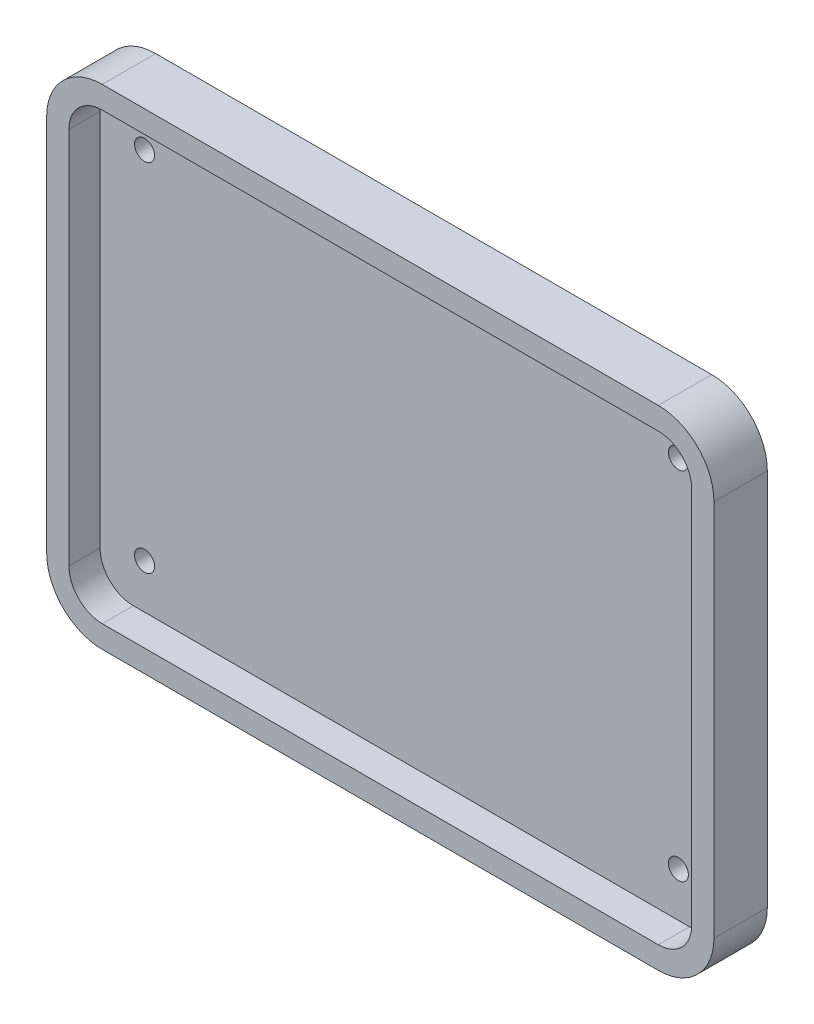
ISO-10303-21;
HEADER;
FILE_DESCRIPTION(('STEP AP214'),'2;1');
FILE_NAME('part.step','',(''),(''),'','','');
FILE_SCHEMA(('AUTOMOTIVE_DESIGN { 1 0 10303 214 1 1 1 1 }'));
ENDSEC;
DATA;
#1=APPLICATION_CONTEXT('core data for automotive mechanical design processes');
#2=APPLICATION_PROTOCOL_DEFINITION('international standard','automotive_design',2000,#1);
#3=PRODUCT_CONTEXT('',#1,'mechanical');
#4=PRODUCT('Part','Part','',(#3));
#5=PRODUCT_RELATED_PRODUCT_CATEGORY('part','',(#4));
#6=PRODUCT_DEFINITION_FORMATION('','',#4);
#7=PRODUCT_DEFINITION_CONTEXT('part definition',#1,'design');
#8=PRODUCT_DEFINITION('design','',#6,#7);
#9=PRODUCT_DEFINITION_SHAPE('','',#8);
#10=(LENGTH_UNIT() NAMED_UNIT(*) SI_UNIT(.MILLI.,.METRE.));
#11=(NAMED_UNIT(*) PLANE_ANGLE_UNIT() SI_UNIT($,.RADIAN.));
#12=(NAMED_UNIT(*) SI_UNIT($,.STERADIAN.) SOLID_ANGLE_UNIT());
#13=UNCERTAINTY_MEASURE_WITH_UNIT(LENGTH_MEASURE(1.E-05),#10,'distance_accuracy_value','');
#14=(GEOMETRIC_REPRESENTATION_CONTEXT(3) GLOBAL_UNCERTAINTY_ASSIGNED_CONTEXT((#13)) GLOBAL_UNIT_ASSIGNED_CONTEXT((#10,
#11,#12)) REPRESENTATION_CONTEXT('',''));
#15=CARTESIAN_POINT('',(0.,0.,0.));
#16=DIRECTION('',(0.,0.,1.));
#17=DIRECTION('',(1.,0.,0.));
#18=AXIS2_PLACEMENT_3D('',#15,#16,#17);
#19=CARTESIAN_POINT('',(75.,-55.,12.));
#20=DIRECTION('',(-1.,0.,0.));
#21=DIRECTION('',(0.,0.,1.));
#22=AXIS2_PLACEMENT_3D('',#19,#20,#21);
#23=PLANE('',#22);
#24=DIRECTION('',(0.,1.,0.));
#25=VECTOR('',#24,1.);
#26=CARTESIAN_POINT('',(75.,-55.,0.));
#27=LINE('',#26,#25);
#28=CARTESIAN_POINT('',(75.,-42.5,0.));
#29=VERTEX_POINT('',#28);
#30=CARTESIAN_POINT('',(75.,42.5,0.));
#31=VERTEX_POINT('',#30);
#32=EDGE_CURVE('E238',#29,#31,#27,.T.);
#33=ORIENTED_EDGE('',*,*,#32,.T.);
#34=DIRECTION('',(0.,0.,-1.));
#35=VECTOR('',#34,1.);
#36=CARTESIAN_POINT('',(75.,42.5,12.));
#37=LINE('',#36,#35);
#38=CARTESIAN_POINT('',(75.,42.5,12.));
#39=VERTEX_POINT('',#38);
#40=EDGE_CURVE('E11',#31,#39,#37,.F.);
#41=ORIENTED_EDGE('',*,*,#40,.T.);
#42=DIRECTION('',(0.,1.,0.));
#43=VECTOR('',#42,1.);
#44=CARTESIAN_POINT('',(75.,-55.,12.));
#45=LINE('',#44,#43);
#46=CARTESIAN_POINT('',(75.,-42.5,12.));
#47=VERTEX_POINT('',#46);
#48=EDGE_CURVE('E221',#47,#39,#45,.T.);
#49=ORIENTED_EDGE('',*,*,#48,.F.);
#50=DIRECTION('',(0.,0.,-1.));
#51=VECTOR('',#50,1.);
#52=CARTESIAN_POINT('',(75.,-42.5,12.));
#53=LINE('',#52,#51);
#54=EDGE_CURVE('E47',#47,#29,#53,.T.);
#55=ORIENTED_EDGE('',*,*,#54,.T.);
#56=EDGE_LOOP('',(#33,#41,#49,#55));
#57=FACE_BOUND('',#56,.T.);
#58=ADVANCED_FACE('F38',(#57),#23,.F.);
#59=CARTESIAN_POINT('',(-75.,55.,12.));
#60=DIRECTION('',(0.,-1.,0.));
#61=DIRECTION('',(0.,0.,-1.));
#62=AXIS2_PLACEMENT_3D('',#59,#60,#61);
#63=PLANE('',#62);
#64=DIRECTION('',(-1.,0.,0.));
#65=VECTOR('',#64,1.);
#66=CARTESIAN_POINT('',(-75.,55.,0.));
#67=LINE('',#66,#65);
#68=CARTESIAN_POINT('',(62.5,55.,0.));
#69=VERTEX_POINT('',#68);
#70=CARTESIAN_POINT('',(-62.5,55.,0.));
#71=VERTEX_POINT('',#70);
#72=EDGE_CURVE('E242',#69,#71,#67,.T.);
#73=ORIENTED_EDGE('',*,*,#72,.T.);
#74=DIRECTION('',(0.,0.,-1.));
#75=VECTOR('',#74,1.);
#76=CARTESIAN_POINT('',(-62.5,55.,12.));
#77=LINE('',#76,#75);
#78=CARTESIAN_POINT('',(-62.5,55.,12.));
#79=VERTEX_POINT('',#78);
#80=EDGE_CURVE('E62',#71,#79,#77,.F.);
#81=ORIENTED_EDGE('',*,*,#80,.T.);
#82=DIRECTION('',(-1.,0.,0.));
#83=VECTOR('',#82,1.);
#84=CARTESIAN_POINT('',(-75.,55.,12.));
#85=LINE('',#84,#83);
#86=CARTESIAN_POINT('',(62.5,55.,12.));
#87=VERTEX_POINT('',#86);
#88=EDGE_CURVE('E225',#87,#79,#85,.T.);
#89=ORIENTED_EDGE('',*,*,#88,.F.);
#90=DIRECTION('',(0.,0.,-1.));
#91=VECTOR('',#90,1.);
#92=CARTESIAN_POINT('',(62.5,55.,12.));
#93=LINE('',#92,#91);
#94=EDGE_CURVE('E290',#87,#69,#93,.T.);
#95=ORIENTED_EDGE('',*,*,#94,.T.);
#96=EDGE_LOOP('',(#73,#81,#89,#95));
#97=FACE_BOUND('',#96,.T.);
#98=ADVANCED_FACE('F312',(#97),#63,.F.);
#99=CARTESIAN_POINT('',(-75.,-55.,12.));
#100=DIRECTION('',(1.,0.,0.));
#101=DIRECTION('',(0.,0.,-1.));
#102=AXIS2_PLACEMENT_3D('',#99,#100,#101);
#103=PLANE('',#102);
#104=DIRECTION('',(0.,-1.,0.));
#105=VECTOR('',#104,1.);
#106=CARTESIAN_POINT('',(-75.,-55.,0.));
#107=LINE('',#106,#105);
#108=CARTESIAN_POINT('',(-75.,42.5,0.));
#109=VERTEX_POINT('',#108);
#110=CARTESIAN_POINT('',(-75.,-42.5,0.));
#111=VERTEX_POINT('',#110);
#112=EDGE_CURVE('E246',#109,#111,#107,.T.);
#113=ORIENTED_EDGE('',*,*,#112,.T.);
#114=DIRECTION('',(0.,0.,-1.));
#115=VECTOR('',#114,1.);
#116=CARTESIAN_POINT('',(-75.,-42.5,12.));
#117=LINE('',#116,#115);
#118=CARTESIAN_POINT('',(-75.,-42.5,12.));
#119=VERTEX_POINT('',#118);
#120=EDGE_CURVE('E275',#111,#119,#117,.F.);
#121=ORIENTED_EDGE('',*,*,#120,.T.);
#122=DIRECTION('',(0.,-1.,0.));
#123=VECTOR('',#122,1.);
#124=CARTESIAN_POINT('',(-75.,-55.,12.));
#125=LINE('',#124,#123);
#126=CARTESIAN_POINT('',(-75.,42.5,12.));
#127=VERTEX_POINT('',#126);
#128=EDGE_CURVE('E229',#127,#119,#125,.T.);
#129=ORIENTED_EDGE('',*,*,#128,.F.);
#130=DIRECTION('',(0.,0.,-1.));
#131=VECTOR('',#130,1.);
#132=CARTESIAN_POINT('',(-75.,42.5,12.));
#133=LINE('',#132,#131);
#134=EDGE_CURVE('E271',#127,#109,#133,.T.);
#135=ORIENTED_EDGE('',*,*,#134,.T.);
#136=EDGE_LOOP('',(#113,#121,#129,#135));
#137=FACE_BOUND('',#136,.T.);
#138=ADVANCED_FACE('F322',(#137),#103,.F.);
#139=CARTESIAN_POINT('',(-75.,-55.,12.));
#140=DIRECTION('',(0.,1.,0.));
#141=DIRECTION('',(0.,0.,1.));
#142=AXIS2_PLACEMENT_3D('',#139,#140,#141);
#143=PLANE('',#142);
#144=DIRECTION('',(1.,0.,0.));
#145=VECTOR('',#144,1.);
#146=CARTESIAN_POINT('',(-75.,-55.,12.));
#147=LINE('',#146,#145);
#148=CARTESIAN_POINT('',(-62.5,-55.,12.));
#149=VERTEX_POINT('',#148);
#150=CARTESIAN_POINT('',(62.5,-55.,12.));
#151=VERTEX_POINT('',#150);
#152=EDGE_CURVE('E233',#149,#151,#147,.T.);
#153=ORIENTED_EDGE('',*,*,#152,.F.);
#154=DIRECTION('',(0.,0.,-1.));
#155=VECTOR('',#154,1.);
#156=CARTESIAN_POINT('',(-62.5,-55.,12.));
#157=LINE('',#156,#155);
#158=CARTESIAN_POINT('',(-62.5,-55.,0.));
#159=VERTEX_POINT('',#158);
#160=EDGE_CURVE('E255',#149,#159,#157,.T.);
#161=ORIENTED_EDGE('',*,*,#160,.T.);
#162=DIRECTION('',(1.,0.,0.));
#163=VECTOR('',#162,1.);
#164=CARTESIAN_POINT('',(-75.,-55.,0.));
#165=LINE('',#164,#163);
#166=CARTESIAN_POINT('',(62.5,-55.,0.));
#167=VERTEX_POINT('',#166);
#168=EDGE_CURVE('E226',#159,#167,#165,.T.);
#169=ORIENTED_EDGE('',*,*,#168,.T.);
#170=DIRECTION('',(0.,0.,-1.));
#171=VECTOR('',#170,1.);
#172=CARTESIAN_POINT('',(62.5,-55.,12.));
#173=LINE('',#172,#171);
#174=EDGE_CURVE('E237',#167,#151,#173,.F.);
#175=ORIENTED_EDGE('',*,*,#174,.T.);
#176=EDGE_LOOP('',(#153,#161,#169,#175));
#177=FACE_BOUND('',#176,.T.);
#178=ADVANCED_FACE('F330',(#177),#143,.F.);
#179=CARTESIAN_POINT('',(0.,0.,12.));
#180=DIRECTION('',(0.,0.,-1.));
#181=DIRECTION('',(-1.,0.,0.));
#182=AXIS2_PLACEMENT_3D('',#179,#180,#181);
#183=PLANE('',#182);
#184=DIRECTION('',(0.,-1.,0.));
#185=VECTOR('',#184,1.);
#186=CARTESIAN_POINT('',(-70.,0.,12.));
#187=LINE('',#186,#185);
#188=CARTESIAN_POINT('',(-70.,42.5,12.));
#189=VERTEX_POINT('',#188);
#190=CARTESIAN_POINT('',(-70.,-42.5,12.));
#191=VERTEX_POINT('',#190);
#192=EDGE_CURVE('E182',#189,#191,#187,.T.);
#193=ORIENTED_EDGE('',*,*,#192,.F.);
#194=CARTESIAN_POINT('',(-62.5,42.5,12.));
#195=DIRECTION('',(0.,0.,-1.));
#196=DIRECTION('',(-1.,0.,0.));
#197=AXIS2_PLACEMENT_3D('',#194,#195,#196);
#198=CIRCLE('',#197,7.5);
#199=CARTESIAN_POINT('',(-62.5,50.,12.));
#200=VERTEX_POINT('',#199);
#201=EDGE_CURVE('E207',#200,#189,#198,.F.);
#202=ORIENTED_EDGE('',*,*,#201,.F.);
#203=DIRECTION('',(-1.,0.,0.));
#204=VECTOR('',#203,1.);
#205=CARTESIAN_POINT('',(0.,50.,12.));
#206=LINE('',#205,#204);
#207=CARTESIAN_POINT('',(62.5,50.,12.));
#208=VERTEX_POINT('',#207);
#209=EDGE_CURVE('E54',#208,#200,#206,.T.);
#210=ORIENTED_EDGE('',*,*,#209,.F.);
#211=CARTESIAN_POINT('',(62.5,42.5,12.));
#212=DIRECTION('',(0.,0.,-1.));
#213=DIRECTION('',(-1.,0.,0.));
#214=AXIS2_PLACEMENT_3D('',#211,#212,#213);
#215=CIRCLE('',#214,7.5);
#216=CARTESIAN_POINT('',(70.,42.5,12.));
#217=VERTEX_POINT('',#216);
#218=EDGE_CURVE('E189',#217,#208,#215,.F.);
#219=ORIENTED_EDGE('',*,*,#218,.F.);
#220=DIRECTION('',(0.,1.,0.));
#221=VECTOR('',#220,1.);
#222=CARTESIAN_POINT('',(70.,0.,12.));
#223=LINE('',#222,#221);
#224=CARTESIAN_POINT('',(70.,-42.5,12.));
#225=VERTEX_POINT('',#224);
#226=EDGE_CURVE('E201',#225,#217,#223,.T.);
#227=ORIENTED_EDGE('',*,*,#226,.F.);
#228=CARTESIAN_POINT('',(62.5,-42.5,12.));
#229=DIRECTION('',(0.,0.,-1.));
#230=DIRECTION('',(-1.,0.,0.));
#231=AXIS2_PLACEMENT_3D('',#228,#229,#230);
#232=CIRCLE('',#231,7.5);
#233=CARTESIAN_POINT('',(62.5,-50.,12.));
#234=VERTEX_POINT('',#233);
#235=EDGE_CURVE('E185',#234,#225,#232,.F.);
#236=ORIENTED_EDGE('',*,*,#235,.F.);
#237=DIRECTION('',(1.,0.,0.));
#238=VECTOR('',#237,1.);
#239=CARTESIAN_POINT('',(0.,-50.,12.));
#240=LINE('',#239,#238);
#241=CARTESIAN_POINT('',(-62.5,-50.,12.));
#242=VERTEX_POINT('',#241);
#243=EDGE_CURVE('E200',#242,#234,#240,.T.);
#244=ORIENTED_EDGE('',*,*,#243,.F.);
#245=CARTESIAN_POINT('',(-62.5,-42.5,12.));
#246=DIRECTION('',(0.,0.,-1.));
#247=DIRECTION('',(-1.,0.,0.));
#248=AXIS2_PLACEMENT_3D('',#245,#246,#247);
#249=CIRCLE('',#248,7.5);
#250=EDGE_CURVE('E212',#191,#242,#249,.F.);
#251=ORIENTED_EDGE('',*,*,#250,.F.);
#252=EDGE_LOOP('',(#193,#202,#210,#219,#227,#236,#244,#251));
#253=FACE_BOUND('',#252,.T.);
#254=ORIENTED_EDGE('',*,*,#128,.T.);
#255=CARTESIAN_POINT('',(-62.5,-42.5,12.));
#256=DIRECTION('',(0.,0.,-1.));
#257=DIRECTION('',(-1.,0.,0.));
#258=AXIS2_PLACEMENT_3D('',#255,#256,#257);
#259=CIRCLE('',#258,12.5);
#260=EDGE_CURVE('E287',#119,#149,#259,.F.);
#261=ORIENTED_EDGE('',*,*,#260,.T.);
#262=ORIENTED_EDGE('',*,*,#152,.T.);
#263=CARTESIAN_POINT('',(62.5,-42.5,12.));
#264=DIRECTION('',(0.,0.,-1.));
#265=DIRECTION('',(-1.,0.,0.));
#266=AXIS2_PLACEMENT_3D('',#263,#264,#265);
#267=CIRCLE('',#266,12.5);
#268=EDGE_CURVE('E278',#151,#47,#267,.F.);
#269=ORIENTED_EDGE('',*,*,#268,.T.);
#270=ORIENTED_EDGE('',*,*,#48,.T.);
#271=CARTESIAN_POINT('',(62.5,42.5,12.));
#272=DIRECTION('',(0.,0.,-1.));
#273=DIRECTION('',(-1.,0.,0.));
#274=AXIS2_PLACEMENT_3D('',#271,#272,#273);
#275=CIRCLE('',#274,12.5);
#276=EDGE_CURVE('E281',#39,#87,#275,.F.);
#277=ORIENTED_EDGE('',*,*,#276,.T.);
#278=ORIENTED_EDGE('',*,*,#88,.T.);
#279=CARTESIAN_POINT('',(-62.5,42.5,12.));
#280=DIRECTION('',(0.,0.,-1.));
#281=DIRECTION('',(-1.,0.,0.));
#282=AXIS2_PLACEMENT_3D('',#279,#280,#281);
#283=CIRCLE('',#282,12.5);
#284=EDGE_CURVE('E284',#79,#127,#283,.F.);
#285=ORIENTED_EDGE('',*,*,#284,.T.);
#286=EDGE_LOOP('',(#254,#261,#262,#269,#270,#277,#278,#285));
#287=FACE_BOUND('',#286,.T.);
#288=ADVANCED_FACE('F315',(#253,#287),#183,.F.);
#289=CARTESIAN_POINT('',(0.,0.,0.));
#290=DIRECTION('',(0.,0.,-1.));
#291=DIRECTION('',(-1.,0.,0.));
#292=AXIS2_PLACEMENT_3D('',#289,#290,#291);
#293=PLANE('',#292);
#294=CARTESIAN_POINT('',(-60.,-40.,0.));
#295=DIRECTION('',(0.,0.,1.));
#296=DIRECTION('',(-1.,0.,0.));
#297=AXIS2_PLACEMENT_3D('',#294,#295,#296);
#298=CIRCLE('',#297,2.25);
#299=CARTESIAN_POINT('',(-62.25,-40.,0.));
#300=VERTEX_POINT('',#299);
#301=EDGE_CURVE('E539',#300,#300,#298,.T.);
#302=ORIENTED_EDGE('',*,*,#301,.T.);
#303=EDGE_LOOP('',(#302));
#304=FACE_BOUND('',#303,.T.);
#305=CARTESIAN_POINT('',(60.,-40.,0.));
#306=DIRECTION('',(0.,0.,1.));
#307=DIRECTION('',(-1.,0.,0.));
#308=AXIS2_PLACEMENT_3D('',#305,#306,#307);
#309=CIRCLE('',#308,2.25);
#310=CARTESIAN_POINT('',(57.75,-40.,0.));
#311=VERTEX_POINT('',#310);
#312=EDGE_CURVE('E601',#311,#311,#309,.T.);
#313=ORIENTED_EDGE('',*,*,#312,.T.);
#314=EDGE_LOOP('',(#313));
#315=FACE_BOUND('',#314,.T.);
#316=CARTESIAN_POINT('',(60.,40.,0.));
#317=DIRECTION('',(0.,0.,1.));
#318=DIRECTION('',(1.,0.,0.));
#319=AXIS2_PLACEMENT_3D('',#316,#317,#318);
#320=CIRCLE('',#319,2.25);
#321=CARTESIAN_POINT('',(62.25,40.,0.));
#322=VERTEX_POINT('',#321);
#323=EDGE_CURVE('E559',#322,#322,#320,.T.);
#324=ORIENTED_EDGE('',*,*,#323,.T.);
#325=EDGE_LOOP('',(#324));
#326=FACE_BOUND('',#325,.T.);
#327=CARTESIAN_POINT('',(-60.,40.,0.));
#328=DIRECTION('',(0.,0.,1.));
#329=DIRECTION('',(1.,0.,0.));
#330=AXIS2_PLACEMENT_3D('',#327,#328,#329);
#331=CIRCLE('',#330,2.25);
#332=CARTESIAN_POINT('',(-57.75,40.,0.));
#333=VERTEX_POINT('',#332);
#334=EDGE_CURVE('E550',#333,#333,#331,.T.);
#335=ORIENTED_EDGE('',*,*,#334,.T.);
#336=EDGE_LOOP('',(#335));
#337=FACE_BOUND('',#336,.T.);
#338=ORIENTED_EDGE('',*,*,#168,.F.);
#339=CARTESIAN_POINT('',(-62.5,-42.5,0.));
#340=DIRECTION('',(0.,0.,-1.));
#341=DIRECTION('',(-1.,0.,0.));
#342=AXIS2_PLACEMENT_3D('',#339,#340,#341);
#343=CIRCLE('',#342,12.5);
#344=EDGE_CURVE('E268',#159,#111,#343,.T.);
#345=ORIENTED_EDGE('',*,*,#344,.T.);
#346=ORIENTED_EDGE('',*,*,#112,.F.);
#347=CARTESIAN_POINT('',(-62.5,42.5,0.));
#348=DIRECTION('',(0.,0.,-1.));
#349=DIRECTION('',(-1.,0.,0.));
#350=AXIS2_PLACEMENT_3D('',#347,#348,#349);
#351=CIRCLE('',#350,12.5);
#352=EDGE_CURVE('E265',#109,#71,#351,.T.);
#353=ORIENTED_EDGE('',*,*,#352,.T.);
#354=ORIENTED_EDGE('',*,*,#72,.F.);
#355=CARTESIAN_POINT('',(62.5,42.5,0.));
#356=DIRECTION('',(0.,0.,-1.));
#357=DIRECTION('',(-1.,0.,0.));
#358=AXIS2_PLACEMENT_3D('',#355,#356,#357);
#359=CIRCLE('',#358,12.5);
#360=EDGE_CURVE('E262',#69,#31,#359,.T.);
#361=ORIENTED_EDGE('',*,*,#360,.T.);
#362=ORIENTED_EDGE('',*,*,#32,.F.);
#363=CARTESIAN_POINT('',(62.5,-42.5,0.));
#364=DIRECTION('',(0.,0.,-1.));
#365=DIRECTION('',(-1.,0.,0.));
#366=AXIS2_PLACEMENT_3D('',#363,#364,#365);
#367=CIRCLE('',#366,12.5);
#368=EDGE_CURVE('E259',#29,#167,#367,.T.);
#369=ORIENTED_EDGE('',*,*,#368,.T.);
#370=EDGE_LOOP('',(#338,#345,#346,#353,#354,#361,#362,#369));
#371=FACE_BOUND('',#370,.T.);
#372=ADVANCED_FACE('F306',(#304,#315,#326,#337,#371),#293,.T.);
#373=CARTESIAN_POINT('',(-62.5,-42.5,12.));
#374=DIRECTION('',(0.,0.,-1.));
#375=DIRECTION('',(-1.,0.,0.));
#376=AXIS2_PLACEMENT_3D('',#373,#374,#375);
#377=CYLINDRICAL_SURFACE('',#376,12.5);
#378=ORIENTED_EDGE('',*,*,#260,.F.);
#379=ORIENTED_EDGE('',*,*,#120,.F.);
#380=ORIENTED_EDGE('',*,*,#344,.F.);
#381=ORIENTED_EDGE('',*,*,#160,.F.);
#382=EDGE_LOOP('',(#378,#379,#380,#381));
#383=FACE_BOUND('',#382,.T.);
#384=ADVANCED_FACE('F327',(#383),#377,.T.);
#385=CARTESIAN_POINT('',(-62.5,42.5,12.));
#386=DIRECTION('',(0.,0.,-1.));
#387=DIRECTION('',(-1.,0.,0.));
#388=AXIS2_PLACEMENT_3D('',#385,#386,#387);
#389=CYLINDRICAL_SURFACE('',#388,12.5);
#390=ORIENTED_EDGE('',*,*,#284,.F.);
#391=ORIENTED_EDGE('',*,*,#80,.F.);
#392=ORIENTED_EDGE('',*,*,#352,.F.);
#393=ORIENTED_EDGE('',*,*,#134,.F.);
#394=EDGE_LOOP('',(#390,#391,#392,#393));
#395=FACE_BOUND('',#394,.T.);
#396=ADVANCED_FACE('F319',(#395),#389,.T.);
#397=CARTESIAN_POINT('',(62.5,42.5,12.));
#398=DIRECTION('',(0.,0.,-1.));
#399=DIRECTION('',(-1.,0.,0.));
#400=AXIS2_PLACEMENT_3D('',#397,#398,#399);
#401=CYLINDRICAL_SURFACE('',#400,12.5);
#402=ORIENTED_EDGE('',*,*,#276,.F.);
#403=ORIENTED_EDGE('',*,*,#40,.F.);
#404=ORIENTED_EDGE('',*,*,#360,.F.);
#405=ORIENTED_EDGE('',*,*,#94,.F.);
#406=EDGE_LOOP('',(#402,#403,#404,#405));
#407=FACE_BOUND('',#406,.T.);
#408=ADVANCED_FACE('F311',(#407),#401,.T.);
#409=CARTESIAN_POINT('',(62.5,-42.5,12.));
#410=DIRECTION('',(0.,0.,-1.));
#411=DIRECTION('',(-1.,0.,0.));
#412=AXIS2_PLACEMENT_3D('',#409,#410,#411);
#413=CYLINDRICAL_SURFACE('',#412,12.5);
#414=ORIENTED_EDGE('',*,*,#268,.F.);
#415=ORIENTED_EDGE('',*,*,#174,.F.);
#416=ORIENTED_EDGE('',*,*,#368,.F.);
#417=ORIENTED_EDGE('',*,*,#54,.F.);
#418=EDGE_LOOP('',(#414,#415,#416,#417));
#419=FACE_BOUND('',#418,.T.);
#420=ADVANCED_FACE('F40',(#419),#413,.T.);
#421=CARTESIAN_POINT('',(70.,-55.,12.));
#422=DIRECTION('',(-1.,0.,0.));
#423=DIRECTION('',(0.,0.,1.));
#424=AXIS2_PLACEMENT_3D('',#421,#422,#423);
#425=PLANE('',#424);
#426=DIRECTION('',(0.,1.,0.));
#427=VECTOR('',#426,1.);
#428=CARTESIAN_POINT('',(70.,0.,5.));
#429=LINE('',#428,#427);
#430=CARTESIAN_POINT('',(70.,-42.5,5.));
#431=VERTEX_POINT('',#430);
#432=CARTESIAN_POINT('',(70.,42.5,5.));
#433=VERTEX_POINT('',#432);
#434=EDGE_CURVE('E554',#431,#433,#429,.T.);
#435=ORIENTED_EDGE('',*,*,#434,.F.);
#436=DIRECTION('',(0.,0.,1.));
#437=VECTOR('',#436,1.);
#438=CARTESIAN_POINT('',(70.,-42.5,12.));
#439=LINE('',#438,#437);
#440=EDGE_CURVE('E565',#225,#431,#439,.F.);
#441=ORIENTED_EDGE('',*,*,#440,.F.);
#442=ORIENTED_EDGE('',*,*,#226,.T.);
#443=DIRECTION('',(0.,0.,1.));
#444=VECTOR('',#443,1.);
#445=CARTESIAN_POINT('',(70.,42.5,12.));
#446=LINE('',#445,#444);
#447=EDGE_CURVE('E243',#433,#217,#446,.T.);
#448=ORIENTED_EDGE('',*,*,#447,.F.);
#449=EDGE_LOOP('',(#435,#441,#442,#448));
#450=FACE_BOUND('',#449,.T.);
#451=ADVANCED_FACE('F333',(#450),#425,.T.);
#452=CARTESIAN_POINT('',(-75.,50.,12.));
#453=DIRECTION('',(0.,-1.,0.));
#454=DIRECTION('',(0.,0.,-1.));
#455=AXIS2_PLACEMENT_3D('',#452,#453,#454);
#456=PLANE('',#455);
#457=DIRECTION('',(-1.,0.,0.));
#458=VECTOR('',#457,1.);
#459=CARTESIAN_POINT('',(0.,50.,5.));
#460=LINE('',#459,#458);
#461=CARTESIAN_POINT('',(62.5,50.,5.));
#462=VERTEX_POINT('',#461);
#463=CARTESIAN_POINT('',(-62.5,50.,5.));
#464=VERTEX_POINT('',#463);
#465=EDGE_CURVE('E178',#462,#464,#460,.T.);
#466=ORIENTED_EDGE('',*,*,#465,.F.);
#467=DIRECTION('',(0.,0.,-1.));
#468=VECTOR('',#467,1.);
#469=CARTESIAN_POINT('',(62.5,50.,12.));
#470=LINE('',#469,#468);
#471=EDGE_CURVE('E217',#208,#462,#470,.T.);
#472=ORIENTED_EDGE('',*,*,#471,.F.);
#473=ORIENTED_EDGE('',*,*,#209,.T.);
#474=DIRECTION('',(0.,0.,-1.));
#475=VECTOR('',#474,1.);
#476=CARTESIAN_POINT('',(-62.5,50.,12.));
#477=LINE('',#476,#475);
#478=EDGE_CURVE('E569',#464,#200,#477,.F.);
#479=ORIENTED_EDGE('',*,*,#478,.F.);
#480=EDGE_LOOP('',(#466,#472,#473,#479));
#481=FACE_BOUND('',#480,.T.);
#482=ADVANCED_FACE('F338',(#481),#456,.T.);
#483=CARTESIAN_POINT('',(-70.,-55.,12.));
#484=DIRECTION('',(1.,0.,0.));
#485=DIRECTION('',(0.,0.,-1.));
#486=AXIS2_PLACEMENT_3D('',#483,#484,#485);
#487=PLANE('',#486);
#488=DIRECTION('',(0.,-1.,0.));
#489=VECTOR('',#488,1.);
#490=CARTESIAN_POINT('',(-70.,0.,5.));
#491=LINE('',#490,#489);
#492=CARTESIAN_POINT('',(-70.,42.5,5.));
#493=VERTEX_POINT('',#492);
#494=CARTESIAN_POINT('',(-70.,-42.5,5.));
#495=VERTEX_POINT('',#494);
#496=EDGE_CURVE('E170',#493,#495,#491,.T.);
#497=ORIENTED_EDGE('',*,*,#496,.F.);
#498=DIRECTION('',(0.,0.,-1.));
#499=VECTOR('',#498,1.);
#500=CARTESIAN_POINT('',(-70.,42.5,12.));
#501=LINE('',#500,#499);
#502=EDGE_CURVE('E166',#189,#493,#501,.T.);
#503=ORIENTED_EDGE('',*,*,#502,.F.);
#504=ORIENTED_EDGE('',*,*,#192,.T.);
#505=DIRECTION('',(0.,0.,-1.));
#506=VECTOR('',#505,1.);
#507=CARTESIAN_POINT('',(-70.,-42.5,12.));
#508=LINE('',#507,#506);
#509=EDGE_CURVE('E158',#495,#191,#508,.F.);
#510=ORIENTED_EDGE('',*,*,#509,.F.);
#511=EDGE_LOOP('',(#497,#503,#504,#510));
#512=FACE_BOUND('',#511,.T.);
#513=ADVANCED_FACE('F180',(#512),#487,.T.);
#514=CARTESIAN_POINT('',(-75.,-50.,12.));
#515=DIRECTION('',(0.,1.,0.));
#516=DIRECTION('',(0.,0.,1.));
#517=AXIS2_PLACEMENT_3D('',#514,#515,#516);
#518=PLANE('',#517);
#519=ORIENTED_EDGE('',*,*,#243,.T.);
#520=DIRECTION('',(0.,0.,1.));
#521=VECTOR('',#520,1.);
#522=CARTESIAN_POINT('',(62.5,-50.,12.));
#523=LINE('',#522,#521);
#524=CARTESIAN_POINT('',(62.5,-50.,5.));
#525=VERTEX_POINT('',#524);
#526=EDGE_CURVE('E197',#525,#234,#523,.T.);
#527=ORIENTED_EDGE('',*,*,#526,.F.);
#528=DIRECTION('',(1.,0.,0.));
#529=VECTOR('',#528,1.);
#530=CARTESIAN_POINT('',(0.,-50.,5.));
#531=LINE('',#530,#529);
#532=CARTESIAN_POINT('',(-62.5,-50.,5.));
#533=VERTEX_POINT('',#532);
#534=EDGE_CURVE('E177',#533,#525,#531,.T.);
#535=ORIENTED_EDGE('',*,*,#534,.F.);
#536=DIRECTION('',(0.,0.,1.));
#537=VECTOR('',#536,1.);
#538=CARTESIAN_POINT('',(-62.5,-50.,12.));
#539=LINE('',#538,#537);
#540=EDGE_CURVE('E161',#242,#533,#539,.F.);
#541=ORIENTED_EDGE('',*,*,#540,.F.);
#542=EDGE_LOOP('',(#519,#527,#535,#541));
#543=FACE_BOUND('',#542,.T.);
#544=ADVANCED_FACE('F400',(#543),#518,.T.);
#545=CARTESIAN_POINT('',(0.,0.,5.));
#546=DIRECTION('',(0.,0.,-1.));
#547=DIRECTION('',(-1.,0.,0.));
#548=AXIS2_PLACEMENT_3D('',#545,#546,#547);
#549=PLANE('',#548);
#550=CARTESIAN_POINT('',(-60.,-40.,5.));
#551=DIRECTION('',(0.,0.,1.));
#552=DIRECTION('',(-1.,0.,0.));
#553=AXIS2_PLACEMENT_3D('',#550,#551,#552);
#554=CIRCLE('',#553,2.25);
#555=CARTESIAN_POINT('',(-62.25,-40.,5.));
#556=VERTEX_POINT('',#555);
#557=EDGE_CURVE('E542',#556,#556,#554,.T.);
#558=ORIENTED_EDGE('',*,*,#557,.F.);
#559=EDGE_LOOP('',(#558));
#560=FACE_BOUND('',#559,.T.);
#561=CARTESIAN_POINT('',(60.,-40.,5.));
#562=DIRECTION('',(0.,0.,1.));
#563=DIRECTION('',(-1.,0.,0.));
#564=AXIS2_PLACEMENT_3D('',#561,#562,#563);
#565=CIRCLE('',#564,2.25);
#566=CARTESIAN_POINT('',(57.75,-40.,5.));
#567=VERTEX_POINT('',#566);
#568=EDGE_CURVE('E546',#567,#567,#565,.T.);
#569=ORIENTED_EDGE('',*,*,#568,.F.);
#570=EDGE_LOOP('',(#569));
#571=FACE_BOUND('',#570,.T.);
#572=CARTESIAN_POINT('',(60.,40.,5.));
#573=DIRECTION('',(0.,0.,1.));
#574=DIRECTION('',(1.,0.,0.));
#575=AXIS2_PLACEMENT_3D('',#572,#573,#574);
#576=CIRCLE('',#575,2.25);
#577=CARTESIAN_POINT('',(62.25,40.,5.));
#578=VERTEX_POINT('',#577);
#579=EDGE_CURVE('E597',#578,#578,#576,.T.);
#580=ORIENTED_EDGE('',*,*,#579,.F.);
#581=EDGE_LOOP('',(#580));
#582=FACE_BOUND('',#581,.T.);
#583=CARTESIAN_POINT('',(-60.,40.,5.));
#584=DIRECTION('',(0.,0.,1.));
#585=DIRECTION('',(1.,0.,0.));
#586=AXIS2_PLACEMENT_3D('',#583,#584,#585);
#587=CIRCLE('',#586,2.25);
#588=CARTESIAN_POINT('',(-57.75,40.,5.));
#589=VERTEX_POINT('',#588);
#590=EDGE_CURVE('E555',#589,#589,#587,.T.);
#591=ORIENTED_EDGE('',*,*,#590,.F.);
#592=EDGE_LOOP('',(#591));
#593=FACE_BOUND('',#592,.T.);
#594=ORIENTED_EDGE('',*,*,#534,.T.);
#595=CARTESIAN_POINT('',(62.5,-42.5,5.));
#596=DIRECTION('',(0.,0.,-1.));
#597=DIRECTION('',(-1.,0.,0.));
#598=AXIS2_PLACEMENT_3D('',#595,#596,#597);
#599=CIRCLE('',#598,7.5);
#600=EDGE_CURVE('E196',#431,#525,#599,.T.);
#601=ORIENTED_EDGE('',*,*,#600,.F.);
#602=ORIENTED_EDGE('',*,*,#434,.T.);
#603=CARTESIAN_POINT('',(62.5,42.5,5.));
#604=DIRECTION('',(0.,0.,-1.));
#605=DIRECTION('',(-1.,0.,0.));
#606=AXIS2_PLACEMENT_3D('',#603,#604,#605);
#607=CIRCLE('',#606,7.5);
#608=EDGE_CURVE('E574',#462,#433,#607,.T.);
#609=ORIENTED_EDGE('',*,*,#608,.F.);
#610=ORIENTED_EDGE('',*,*,#465,.T.);
#611=CARTESIAN_POINT('',(-62.5,42.5,5.));
#612=DIRECTION('',(0.,0.,-1.));
#613=DIRECTION('',(-1.,0.,0.));
#614=AXIS2_PLACEMENT_3D('',#611,#612,#613);
#615=CIRCLE('',#614,7.5);
#616=EDGE_CURVE('E167',#493,#464,#615,.T.);
#617=ORIENTED_EDGE('',*,*,#616,.F.);
#618=ORIENTED_EDGE('',*,*,#496,.T.);
#619=CARTESIAN_POINT('',(-62.5,-42.5,5.));
#620=DIRECTION('',(0.,0.,-1.));
#621=DIRECTION('',(-1.,0.,0.));
#622=AXIS2_PLACEMENT_3D('',#619,#620,#621);
#623=CIRCLE('',#622,7.5);
#624=EDGE_CURVE('E154',#533,#495,#623,.T.);
#625=ORIENTED_EDGE('',*,*,#624,.F.);
#626=EDGE_LOOP('',(#594,#601,#602,#609,#610,#617,#618,#625));
#627=FACE_BOUND('',#626,.T.);
#628=ADVANCED_FACE('F171',(#560,#571,#582,#593,#627),#549,.F.);
#629=CARTESIAN_POINT('',(-62.5,-42.5,12.));
#630=DIRECTION('',(0.,0.,-1.));
#631=DIRECTION('',(-1.,0.,0.));
#632=AXIS2_PLACEMENT_3D('',#629,#630,#631);
#633=CYLINDRICAL_SURFACE('',#632,7.5);
#634=ORIENTED_EDGE('',*,*,#250,.T.);
#635=ORIENTED_EDGE('',*,*,#540,.T.);
#636=ORIENTED_EDGE('',*,*,#624,.T.);
#637=ORIENTED_EDGE('',*,*,#509,.T.);
#638=EDGE_LOOP('',(#634,#635,#636,#637));
#639=FACE_BOUND('',#638,.T.);
#640=ADVANCED_FACE('F156',(#639),#633,.F.);
#641=CARTESIAN_POINT('',(-62.5,42.5,12.));
#642=DIRECTION('',(0.,0.,-1.));
#643=DIRECTION('',(-1.,0.,0.));
#644=AXIS2_PLACEMENT_3D('',#641,#642,#643);
#645=CYLINDRICAL_SURFACE('',#644,7.5);
#646=ORIENTED_EDGE('',*,*,#201,.T.);
#647=ORIENTED_EDGE('',*,*,#502,.T.);
#648=ORIENTED_EDGE('',*,*,#616,.T.);
#649=ORIENTED_EDGE('',*,*,#478,.T.);
#650=EDGE_LOOP('',(#646,#647,#648,#649));
#651=FACE_BOUND('',#650,.T.);
#652=ADVANCED_FACE('F420',(#651),#645,.F.);
#653=CARTESIAN_POINT('',(62.5,42.5,12.));
#654=DIRECTION('',(0.,0.,-1.));
#655=DIRECTION('',(-1.,0.,0.));
#656=AXIS2_PLACEMENT_3D('',#653,#654,#655);
#657=CYLINDRICAL_SURFACE('',#656,7.5);
#658=ORIENTED_EDGE('',*,*,#218,.T.);
#659=ORIENTED_EDGE('',*,*,#471,.T.);
#660=ORIENTED_EDGE('',*,*,#608,.T.);
#661=ORIENTED_EDGE('',*,*,#447,.T.);
#662=EDGE_LOOP('',(#658,#659,#660,#661));
#663=FACE_BOUND('',#662,.T.);
#664=ADVANCED_FACE('F429',(#663),#657,.F.);
#665=CARTESIAN_POINT('',(62.5,-42.5,12.));
#666=DIRECTION('',(0.,0.,-1.));
#667=DIRECTION('',(-1.,0.,0.));
#668=AXIS2_PLACEMENT_3D('',#665,#666,#667);
#669=CYLINDRICAL_SURFACE('',#668,7.5);
#670=ORIENTED_EDGE('',*,*,#235,.T.);
#671=ORIENTED_EDGE('',*,*,#440,.T.);
#672=ORIENTED_EDGE('',*,*,#600,.T.);
#673=ORIENTED_EDGE('',*,*,#526,.T.);
#674=EDGE_LOOP('',(#670,#671,#672,#673));
#675=FACE_BOUND('',#674,.T.);
#676=ADVANCED_FACE('F439',(#675),#669,.F.);
#677=CARTESIAN_POINT('',(-60.,40.,0.));
#678=DIRECTION('',(0.,0.,1.));
#679=DIRECTION('',(1.,0.,0.));
#680=AXIS2_PLACEMENT_3D('',#677,#678,#679);
#681=CYLINDRICAL_SURFACE('',#680,2.25);
#682=ORIENTED_EDGE('',*,*,#334,.F.);
#683=EDGE_LOOP('',(#682));
#684=FACE_BOUND('',#683,.T.);
#685=ORIENTED_EDGE('',*,*,#590,.T.);
#686=EDGE_LOOP('',(#685));
#687=FACE_BOUND('',#686,.T.);
#688=ADVANCED_FACE('F449',(#684,#687),#681,.F.);
#689=CARTESIAN_POINT('',(60.,40.,0.));
#690=DIRECTION('',(0.,0.,1.));
#691=DIRECTION('',(1.,0.,0.));
#692=AXIS2_PLACEMENT_3D('',#689,#690,#691);
#693=CYLINDRICAL_SURFACE('',#692,2.25);
#694=ORIENTED_EDGE('',*,*,#323,.F.);
#695=EDGE_LOOP('',(#694));
#696=FACE_BOUND('',#695,.T.);
#697=ORIENTED_EDGE('',*,*,#579,.T.);
#698=EDGE_LOOP('',(#697));
#699=FACE_BOUND('',#698,.T.);
#700=ADVANCED_FACE('F474',(#696,#699),#693,.F.);
#701=CARTESIAN_POINT('',(60.,-40.,0.));
#702=DIRECTION('',(0.,0.,1.));
#703=DIRECTION('',(1.,0.,0.));
#704=AXIS2_PLACEMENT_3D('',#701,#702,#703);
#705=CYLINDRICAL_SURFACE('',#704,2.25);
#706=ORIENTED_EDGE('',*,*,#312,.F.);
#707=EDGE_LOOP('',(#706));
#708=FACE_BOUND('',#707,.T.);
#709=ORIENTED_EDGE('',*,*,#568,.T.);
#710=EDGE_LOOP('',(#709));
#711=FACE_BOUND('',#710,.T.);
#712=ADVANCED_FACE('F484',(#708,#711),#705,.F.);
#713=CARTESIAN_POINT('',(-60.,-40.,0.));
#714=DIRECTION('',(0.,0.,1.));
#715=DIRECTION('',(1.,0.,0.));
#716=AXIS2_PLACEMENT_3D('',#713,#714,#715);
#717=CYLINDRICAL_SURFACE('',#716,2.25);
#718=ORIENTED_EDGE('',*,*,#301,.F.);
#719=EDGE_LOOP('',(#718));
#720=FACE_BOUND('',#719,.T.);
#721=ORIENTED_EDGE('',*,*,#557,.T.);
#722=EDGE_LOOP('',(#721));
#723=FACE_BOUND('',#722,.T.);
#724=ADVANCED_FACE('F494',(#720,#723),#717,.F.);
#725=CLOSED_SHELL('',(#58,#98,#138,#178,#288,#372,#384,#396,#408,#420,#451,#482,#513,#544,#628,
#640,#652,#664,#676,#688,#700,#712,#724));
#726=MANIFOLD_SOLID_BREP('B2',#725);
#727=ADVANCED_BREP_SHAPE_REPRESENTATION('',(#18,#726),#14);
#728=SHAPE_DEFINITION_REPRESENTATION(#9,#727);
ENDSEC;
END-ISO-10303-21;
